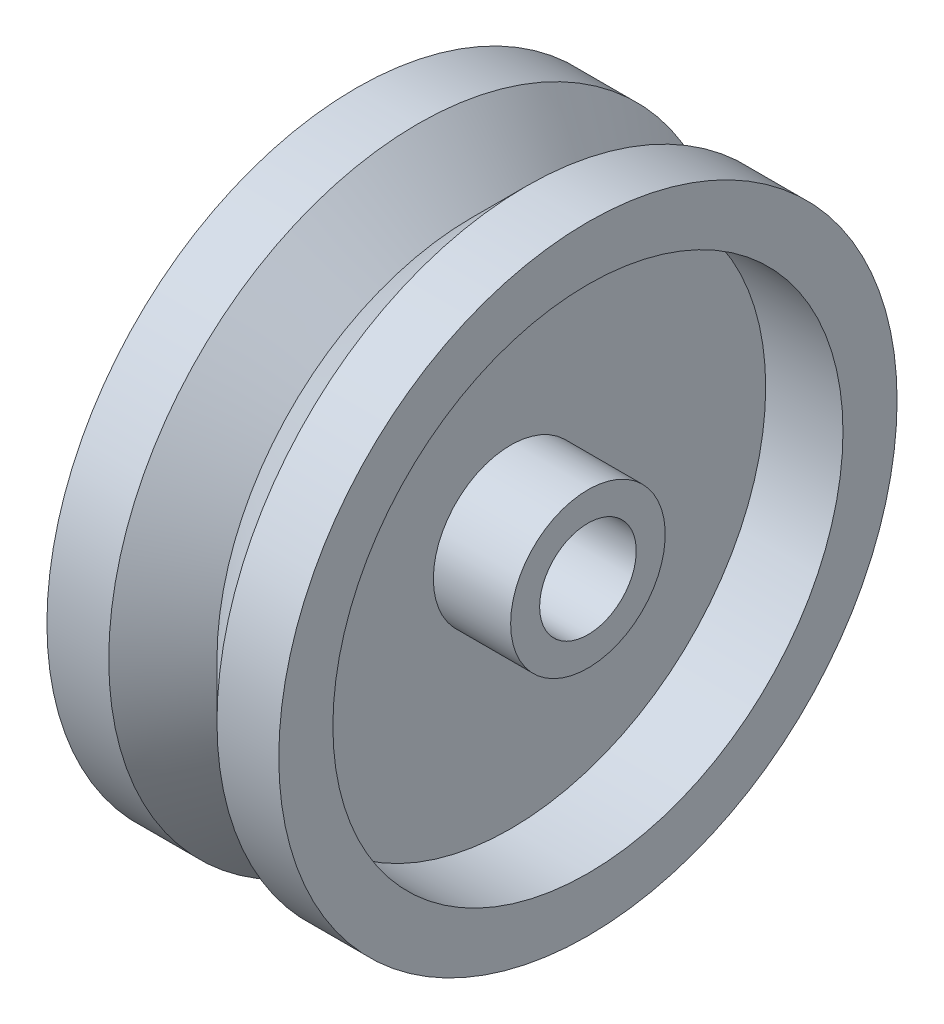
ISO-10303-21;
HEADER;
FILE_DESCRIPTION(('STEP AP214'),'2;1');
FILE_NAME('part.step','',(''),(''),'','','');
FILE_SCHEMA(('AUTOMOTIVE_DESIGN { 1 0 10303 214 1 1 1 1 }'));
ENDSEC;
DATA;
#1=APPLICATION_CONTEXT('core data for automotive mechanical design processes');
#2=APPLICATION_PROTOCOL_DEFINITION('international standard','automotive_design',2000,#1);
#3=PRODUCT_CONTEXT('',#1,'mechanical');
#4=PRODUCT('Part','Part','',(#3));
#5=PRODUCT_RELATED_PRODUCT_CATEGORY('part','',(#4));
#6=PRODUCT_DEFINITION_FORMATION('','',#4);
#7=PRODUCT_DEFINITION_CONTEXT('part definition',#1,'design');
#8=PRODUCT_DEFINITION('design','',#6,#7);
#9=PRODUCT_DEFINITION_SHAPE('','',#8);
#10=(LENGTH_UNIT() NAMED_UNIT(*) SI_UNIT(.MILLI.,.METRE.));
#11=(NAMED_UNIT(*) PLANE_ANGLE_UNIT() SI_UNIT($,.RADIAN.));
#12=(NAMED_UNIT(*) SI_UNIT($,.STERADIAN.) SOLID_ANGLE_UNIT());
#13=UNCERTAINTY_MEASURE_WITH_UNIT(LENGTH_MEASURE(1.E-05),#10,'distance_accuracy_value','');
#14=(GEOMETRIC_REPRESENTATION_CONTEXT(3) GLOBAL_UNCERTAINTY_ASSIGNED_CONTEXT((#13)) GLOBAL_UNIT_ASSIGNED_CONTEXT((#10,
#11,#12)) REPRESENTATION_CONTEXT('',''));
#15=CARTESIAN_POINT('',(0.,0.,0.));
#16=DIRECTION('',(0.,0.,1.));
#17=DIRECTION('',(1.,0.,0.));
#18=AXIS2_PLACEMENT_3D('',#15,#16,#17);
#19=CARTESIAN_POINT('',(0.,0.,0.));
#20=DIRECTION('',(-1.,0.,0.));
#21=DIRECTION('',(0.,0.,1.));
#22=AXIS2_PLACEMENT_3D('',#19,#20,#21);
#23=CONICAL_SURFACE('',#22,16.5,0.785398163397441);
#24=CARTESIAN_POINT('',(-3.50000000000005,0.,0.));
#25=DIRECTION('',(-1.,0.,0.));
#26=DIRECTION('',(0.,0.,1.));
#27=AXIS2_PLACEMENT_3D('',#24,#25,#26);
#28=CIRCLE('',#27,20.);
#29=CARTESIAN_POINT('',(-3.50000000000005,0.,20.));
#30=VERTEX_POINT('',#29);
#31=EDGE_CURVE('E84',#30,#30,#28,.T.);
#32=ORIENTED_EDGE('',*,*,#31,.F.);
#33=EDGE_LOOP('',(#32));
#34=FACE_BOUND('',#33,.T.);
#35=CARTESIAN_POINT('',(0.,0.,0.));
#36=DIRECTION('',(-1.,0.,0.));
#37=DIRECTION('',(0.,0.,1.));
#38=AXIS2_PLACEMENT_3D('',#35,#36,#37);
#39=CIRCLE('',#38,16.5);
#40=CARTESIAN_POINT('',(0.,0.,16.5));
#41=VERTEX_POINT('',#40);
#42=EDGE_CURVE('E10',#41,#41,#39,.T.);
#43=ORIENTED_EDGE('',*,*,#42,.T.);
#44=EDGE_LOOP('',(#43));
#45=FACE_BOUND('',#44,.T.);
#46=ADVANCED_FACE('F35',(#34,#45),#23,.T.);
#47=CARTESIAN_POINT('',(3.50000000000005,0.,0.));
#48=DIRECTION('',(1.,0.,0.));
#49=DIRECTION('',(0.,0.,-1.));
#50=AXIS2_PLACEMENT_3D('',#47,#48,#49);
#51=CONICAL_SURFACE('',#50,20.,0.785398163397441);
#52=ORIENTED_EDGE('',*,*,#42,.F.);
#53=EDGE_LOOP('',(#52));
#54=FACE_BOUND('',#53,.T.);
#55=CARTESIAN_POINT('',(3.50000000000005,0.,0.));
#56=DIRECTION('',(-1.,0.,0.));
#57=DIRECTION('',(0.,0.,1.));
#58=AXIS2_PLACEMENT_3D('',#55,#56,#57);
#59=CIRCLE('',#58,20.);
#60=CARTESIAN_POINT('',(3.50000000000005,0.,20.));
#61=VERTEX_POINT('',#60);
#62=EDGE_CURVE('E41',#61,#61,#59,.T.);
#63=ORIENTED_EDGE('',*,*,#62,.T.);
#64=EDGE_LOOP('',(#63));
#65=FACE_BOUND('',#64,.T.);
#66=ADVANCED_FACE('F91',(#54,#65),#51,.T.);
#67=CARTESIAN_POINT('',(0.,0.,0.));
#68=DIRECTION('',(-1.,0.,0.));
#69=DIRECTION('',(0.,0.,1.));
#70=AXIS2_PLACEMENT_3D('',#67,#68,#69);
#71=CYLINDRICAL_SURFACE('',#70,20.);
#72=ORIENTED_EDGE('',*,*,#62,.F.);
#73=EDGE_LOOP('',(#72));
#74=FACE_BOUND('',#73,.T.);
#75=CARTESIAN_POINT('',(7.5,0.,0.));
#76=DIRECTION('',(-1.,0.,0.));
#77=DIRECTION('',(0.,0.,1.));
#78=AXIS2_PLACEMENT_3D('',#75,#76,#77);
#79=CIRCLE('',#78,20.);
#80=CARTESIAN_POINT('',(7.5,0.,20.));
#81=VERTEX_POINT('',#80);
#82=EDGE_CURVE('E45',#81,#81,#79,.T.);
#83=ORIENTED_EDGE('',*,*,#82,.T.);
#84=EDGE_LOOP('',(#83));
#85=FACE_BOUND('',#84,.T.);
#86=ADVANCED_FACE('F95',(#74,#85),#71,.T.);
#87=CARTESIAN_POINT('',(7.5,20.,0.));
#88=DIRECTION('',(-1.,0.,0.));
#89=DIRECTION('',(0.,0.,1.));
#90=AXIS2_PLACEMENT_3D('',#87,#88,#89);
#91=PLANE('',#90);
#92=ORIENTED_EDGE('',*,*,#82,.F.);
#93=EDGE_LOOP('',(#92));
#94=FACE_BOUND('',#93,.T.);
#95=CARTESIAN_POINT('',(7.5,0.,0.));
#96=DIRECTION('',(-1.,0.,0.));
#97=DIRECTION('',(0.,0.,1.));
#98=AXIS2_PLACEMENT_3D('',#95,#96,#97);
#99=CIRCLE('',#98,16.5);
#100=CARTESIAN_POINT('',(7.5,0.,16.5));
#101=VERTEX_POINT('',#100);
#102=EDGE_CURVE('E49',#101,#101,#99,.T.);
#103=ORIENTED_EDGE('',*,*,#102,.T.);
#104=EDGE_LOOP('',(#103));
#105=FACE_BOUND('',#104,.T.);
#106=ADVANCED_FACE('F100',(#94,#105),#91,.F.);
#107=CARTESIAN_POINT('',(0.,0.,0.));
#108=DIRECTION('',(-1.,0.,0.));
#109=DIRECTION('',(0.,0.,1.));
#110=AXIS2_PLACEMENT_3D('',#107,#108,#109);
#111=CYLINDRICAL_SURFACE('',#110,16.5);
#112=ORIENTED_EDGE('',*,*,#102,.F.);
#113=EDGE_LOOP('',(#112));
#114=FACE_BOUND('',#113,.T.);
#115=CARTESIAN_POINT('',(2.5,0.,0.));
#116=DIRECTION('',(-1.,0.,0.));
#117=DIRECTION('',(0.,0.,1.));
#118=AXIS2_PLACEMENT_3D('',#115,#116,#117);
#119=CIRCLE('',#118,16.5);
#120=CARTESIAN_POINT('',(2.5,0.,16.5));
#121=VERTEX_POINT('',#120);
#122=EDGE_CURVE('E54',#121,#121,#119,.T.);
#123=ORIENTED_EDGE('',*,*,#122,.T.);
#124=EDGE_LOOP('',(#123));
#125=FACE_BOUND('',#124,.T.);
#126=ADVANCED_FACE('F106',(#114,#125),#111,.F.);
#127=CARTESIAN_POINT('',(2.5,16.5,0.));
#128=DIRECTION('',(-1.,0.,0.));
#129=DIRECTION('',(0.,0.,1.));
#130=AXIS2_PLACEMENT_3D('',#127,#128,#129);
#131=PLANE('',#130);
#132=ORIENTED_EDGE('',*,*,#122,.F.);
#133=EDGE_LOOP('',(#132));
#134=FACE_BOUND('',#133,.T.);
#135=CARTESIAN_POINT('',(2.5,0.,0.));
#136=DIRECTION('',(-1.,0.,0.));
#137=DIRECTION('',(0.,0.,1.));
#138=AXIS2_PLACEMENT_3D('',#135,#136,#137);
#139=CIRCLE('',#138,5.);
#140=CARTESIAN_POINT('',(2.5,0.,5.));
#141=VERTEX_POINT('',#140);
#142=EDGE_CURVE('E57',#141,#141,#139,.T.);
#143=ORIENTED_EDGE('',*,*,#142,.T.);
#144=EDGE_LOOP('',(#143));
#145=FACE_BOUND('',#144,.T.);
#146=ADVANCED_FACE('F110',(#134,#145),#131,.F.);
#147=CARTESIAN_POINT('',(0.,0.,0.));
#148=DIRECTION('',(-1.,0.,0.));
#149=DIRECTION('',(0.,0.,1.));
#150=AXIS2_PLACEMENT_3D('',#147,#148,#149);
#151=CYLINDRICAL_SURFACE('',#150,5.);
#152=ORIENTED_EDGE('',*,*,#142,.F.);
#153=EDGE_LOOP('',(#152));
#154=FACE_BOUND('',#153,.T.);
#155=CARTESIAN_POINT('',(7.5,0.,0.));
#156=DIRECTION('',(-1.,0.,0.));
#157=DIRECTION('',(0.,0.,1.));
#158=AXIS2_PLACEMENT_3D('',#155,#156,#157);
#159=CIRCLE('',#158,5.);
#160=CARTESIAN_POINT('',(7.5,0.,5.));
#161=VERTEX_POINT('',#160);
#162=EDGE_CURVE('E60',#161,#161,#159,.T.);
#163=ORIENTED_EDGE('',*,*,#162,.T.);
#164=EDGE_LOOP('',(#163));
#165=FACE_BOUND('',#164,.T.);
#166=ADVANCED_FACE('F114',(#154,#165),#151,.T.);
#167=CARTESIAN_POINT('',(7.5,5.,0.));
#168=DIRECTION('',(-1.,0.,0.));
#169=DIRECTION('',(0.,0.,1.));
#170=AXIS2_PLACEMENT_3D('',#167,#168,#169);
#171=PLANE('',#170);
#172=ORIENTED_EDGE('',*,*,#162,.F.);
#173=EDGE_LOOP('',(#172));
#174=FACE_BOUND('',#173,.T.);
#175=CARTESIAN_POINT('',(7.5,0.,0.));
#176=DIRECTION('',(-1.,0.,0.));
#177=DIRECTION('',(0.,0.,1.));
#178=AXIS2_PLACEMENT_3D('',#175,#176,#177);
#179=CIRCLE('',#178,3.125);
#180=CARTESIAN_POINT('',(7.5,0.,3.125));
#181=VERTEX_POINT('',#180);
#182=EDGE_CURVE('E63',#181,#181,#179,.T.);
#183=ORIENTED_EDGE('',*,*,#182,.T.);
#184=EDGE_LOOP('',(#183));
#185=FACE_BOUND('',#184,.T.);
#186=ADVANCED_FACE('F118',(#174,#185),#171,.F.);
#187=CARTESIAN_POINT('',(0.,0.,0.));
#188=DIRECTION('',(-1.,0.,0.));
#189=DIRECTION('',(0.,0.,1.));
#190=AXIS2_PLACEMENT_3D('',#187,#188,#189);
#191=CYLINDRICAL_SURFACE('',#190,3.125);
#192=ORIENTED_EDGE('',*,*,#182,.F.);
#193=EDGE_LOOP('',(#192));
#194=FACE_BOUND('',#193,.T.);
#195=CARTESIAN_POINT('',(-7.5,0.,0.));
#196=DIRECTION('',(-1.,0.,0.));
#197=DIRECTION('',(0.,0.,1.));
#198=AXIS2_PLACEMENT_3D('',#195,#196,#197);
#199=CIRCLE('',#198,3.12500000000001);
#200=CARTESIAN_POINT('',(-7.5,0.,3.12500000000001));
#201=VERTEX_POINT('',#200);
#202=EDGE_CURVE('E66',#201,#201,#199,.T.);
#203=ORIENTED_EDGE('',*,*,#202,.T.);
#204=EDGE_LOOP('',(#203));
#205=FACE_BOUND('',#204,.T.);
#206=ADVANCED_FACE('F122',(#194,#205),#191,.F.);
#207=CARTESIAN_POINT('',(-7.5,5.00000000000001,0.));
#208=DIRECTION('',(1.,0.,0.));
#209=DIRECTION('',(0.,0.,-1.));
#210=AXIS2_PLACEMENT_3D('',#207,#208,#209);
#211=PLANE('',#210);
#212=ORIENTED_EDGE('',*,*,#202,.F.);
#213=EDGE_LOOP('',(#212));
#214=FACE_BOUND('',#213,.T.);
#215=CARTESIAN_POINT('',(-7.5,0.,0.));
#216=DIRECTION('',(-1.,0.,0.));
#217=DIRECTION('',(0.,0.,1.));
#218=AXIS2_PLACEMENT_3D('',#215,#216,#217);
#219=CIRCLE('',#218,5.00000000000001);
#220=CARTESIAN_POINT('',(-7.5,0.,5.00000000000001));
#221=VERTEX_POINT('',#220);
#222=EDGE_CURVE('E69',#221,#221,#219,.T.);
#223=ORIENTED_EDGE('',*,*,#222,.T.);
#224=EDGE_LOOP('',(#223));
#225=FACE_BOUND('',#224,.T.);
#226=ADVANCED_FACE('F126',(#214,#225),#211,.F.);
#227=CARTESIAN_POINT('',(0.,0.,0.));
#228=DIRECTION('',(-1.,0.,0.));
#229=DIRECTION('',(0.,0.,1.));
#230=AXIS2_PLACEMENT_3D('',#227,#228,#229);
#231=CYLINDRICAL_SURFACE('',#230,5.00000000000001);
#232=ORIENTED_EDGE('',*,*,#222,.F.);
#233=EDGE_LOOP('',(#232));
#234=FACE_BOUND('',#233,.T.);
#235=CARTESIAN_POINT('',(-2.5,0.,0.));
#236=DIRECTION('',(-1.,0.,0.));
#237=DIRECTION('',(0.,0.,1.));
#238=AXIS2_PLACEMENT_3D('',#235,#236,#237);
#239=CIRCLE('',#238,5.00000000000001);
#240=CARTESIAN_POINT('',(-2.5,0.,5.00000000000001));
#241=VERTEX_POINT('',#240);
#242=EDGE_CURVE('E72',#241,#241,#239,.T.);
#243=ORIENTED_EDGE('',*,*,#242,.T.);
#244=EDGE_LOOP('',(#243));
#245=FACE_BOUND('',#244,.T.);
#246=ADVANCED_FACE('F130',(#234,#245),#231,.T.);
#247=CARTESIAN_POINT('',(-2.5,16.5,0.));
#248=DIRECTION('',(1.,0.,0.));
#249=DIRECTION('',(0.,0.,-1.));
#250=AXIS2_PLACEMENT_3D('',#247,#248,#249);
#251=PLANE('',#250);
#252=ORIENTED_EDGE('',*,*,#242,.F.);
#253=EDGE_LOOP('',(#252));
#254=FACE_BOUND('',#253,.T.);
#255=CARTESIAN_POINT('',(-2.5,0.,0.));
#256=DIRECTION('',(-1.,0.,0.));
#257=DIRECTION('',(0.,0.,1.));
#258=AXIS2_PLACEMENT_3D('',#255,#256,#257);
#259=CIRCLE('',#258,16.5);
#260=CARTESIAN_POINT('',(-2.5,0.,16.5));
#261=VERTEX_POINT('',#260);
#262=EDGE_CURVE('E75',#261,#261,#259,.T.);
#263=ORIENTED_EDGE('',*,*,#262,.T.);
#264=EDGE_LOOP('',(#263));
#265=FACE_BOUND('',#264,.T.);
#266=ADVANCED_FACE('F134',(#254,#265),#251,.F.);
#267=CARTESIAN_POINT('',(0.,0.,0.));
#268=DIRECTION('',(-1.,0.,0.));
#269=DIRECTION('',(0.,0.,1.));
#270=AXIS2_PLACEMENT_3D('',#267,#268,#269);
#271=CYLINDRICAL_SURFACE('',#270,16.5);
#272=ORIENTED_EDGE('',*,*,#262,.F.);
#273=EDGE_LOOP('',(#272));
#274=FACE_BOUND('',#273,.T.);
#275=CARTESIAN_POINT('',(-7.5,0.,0.));
#276=DIRECTION('',(-1.,0.,0.));
#277=DIRECTION('',(0.,0.,1.));
#278=AXIS2_PLACEMENT_3D('',#275,#276,#277);
#279=CIRCLE('',#278,16.5);
#280=CARTESIAN_POINT('',(-7.5,0.,16.5));
#281=VERTEX_POINT('',#280);
#282=EDGE_CURVE('E78',#281,#281,#279,.T.);
#283=ORIENTED_EDGE('',*,*,#282,.T.);
#284=EDGE_LOOP('',(#283));
#285=FACE_BOUND('',#284,.T.);
#286=ADVANCED_FACE('F138',(#274,#285),#271,.F.);
#287=CARTESIAN_POINT('',(-7.5,20.,0.));
#288=DIRECTION('',(1.,0.,0.));
#289=DIRECTION('',(0.,0.,-1.));
#290=AXIS2_PLACEMENT_3D('',#287,#288,#289);
#291=PLANE('',#290);
#292=ORIENTED_EDGE('',*,*,#282,.F.);
#293=EDGE_LOOP('',(#292));
#294=FACE_BOUND('',#293,.T.);
#295=CARTESIAN_POINT('',(-7.5,0.,0.));
#296=DIRECTION('',(-1.,0.,0.));
#297=DIRECTION('',(0.,0.,1.));
#298=AXIS2_PLACEMENT_3D('',#295,#296,#297);
#299=CIRCLE('',#298,20.);
#300=CARTESIAN_POINT('',(-7.5,0.,20.));
#301=VERTEX_POINT('',#300);
#302=EDGE_CURVE('E81',#301,#301,#299,.T.);
#303=ORIENTED_EDGE('',*,*,#302,.T.);
#304=EDGE_LOOP('',(#303));
#305=FACE_BOUND('',#304,.T.);
#306=ADVANCED_FACE('F142',(#294,#305),#291,.F.);
#307=CARTESIAN_POINT('',(0.,0.,0.));
#308=DIRECTION('',(-1.,0.,0.));
#309=DIRECTION('',(0.,0.,1.));
#310=AXIS2_PLACEMENT_3D('',#307,#308,#309);
#311=CYLINDRICAL_SURFACE('',#310,20.);
#312=ORIENTED_EDGE('',*,*,#302,.F.);
#313=EDGE_LOOP('',(#312));
#314=FACE_BOUND('',#313,.T.);
#315=ORIENTED_EDGE('',*,*,#31,.T.);
#316=EDGE_LOOP('',(#315));
#317=FACE_BOUND('',#316,.T.);
#318=ADVANCED_FACE('F88',(#314,#317),#311,.T.);
#319=CLOSED_SHELL('',(#46,#66,#86,#106,#126,#146,#166,#186,#206,#226,#246,#266,#286,#306,#318));
#320=MANIFOLD_SOLID_BREP('B2',#319);
#321=ADVANCED_BREP_SHAPE_REPRESENTATION('',(#18,#320),#14);
#322=SHAPE_DEFINITION_REPRESENTATION(#9,#321);
ENDSEC;
END-ISO-10303-21;
